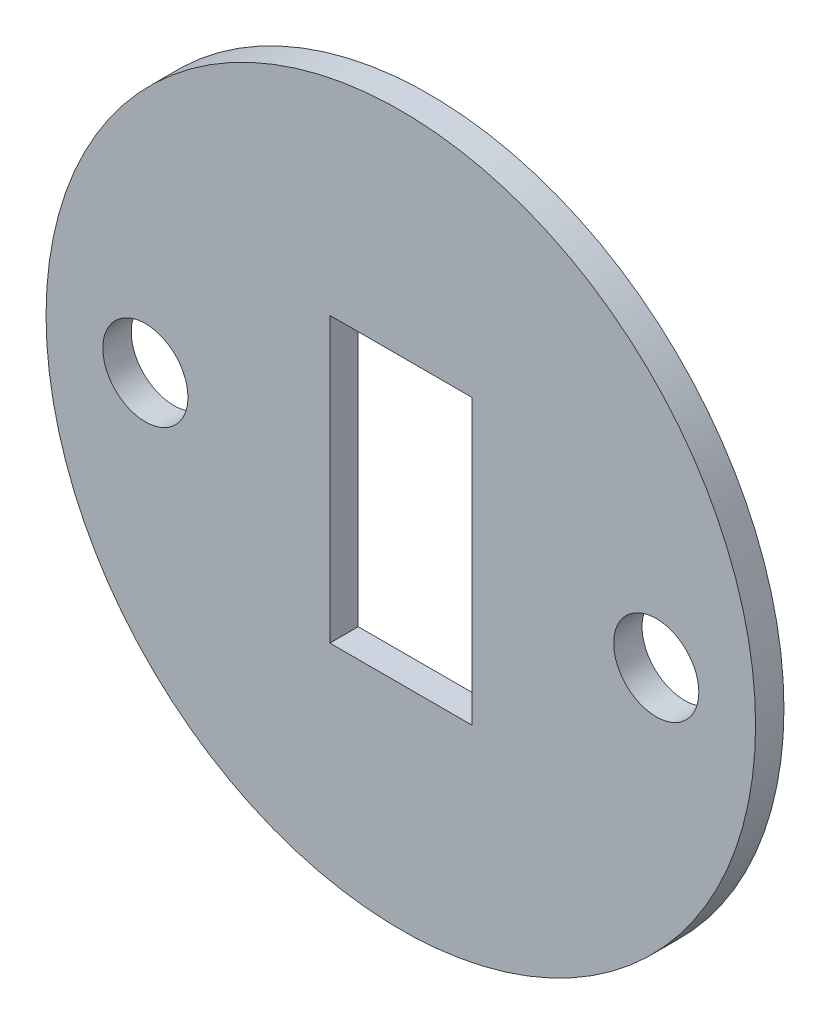
ISO-10303-21;
HEADER;
FILE_DESCRIPTION(('STEP AP214'),'2;1');
FILE_NAME('part.step','',(''),(''),'','','');
FILE_SCHEMA(('AUTOMOTIVE_DESIGN { 1 0 10303 214 1 1 1 1 }'));
ENDSEC;
DATA;
#1=APPLICATION_CONTEXT('core data for automotive mechanical design processes');
#2=APPLICATION_PROTOCOL_DEFINITION('international standard','automotive_design',2000,#1);
#3=PRODUCT_CONTEXT('',#1,'mechanical');
#4=PRODUCT('Part','Part','',(#3));
#5=PRODUCT_RELATED_PRODUCT_CATEGORY('part','',(#4));
#6=PRODUCT_DEFINITION_FORMATION('','',#4);
#7=PRODUCT_DEFINITION_CONTEXT('part definition',#1,'design');
#8=PRODUCT_DEFINITION('design','',#6,#7);
#9=PRODUCT_DEFINITION_SHAPE('','',#8);
#10=(LENGTH_UNIT() NAMED_UNIT(*) SI_UNIT(.MILLI.,.METRE.));
#11=(NAMED_UNIT(*) PLANE_ANGLE_UNIT() SI_UNIT($,.RADIAN.));
#12=(NAMED_UNIT(*) SI_UNIT($,.STERADIAN.) SOLID_ANGLE_UNIT());
#13=UNCERTAINTY_MEASURE_WITH_UNIT(LENGTH_MEASURE(1.E-05),#10,'distance_accuracy_value','');
#14=(GEOMETRIC_REPRESENTATION_CONTEXT(3) GLOBAL_UNCERTAINTY_ASSIGNED_CONTEXT((#13)) GLOBAL_UNIT_ASSIGNED_CONTEXT((#10,
#11,#12)) REPRESENTATION_CONTEXT('',''));
#15=CARTESIAN_POINT('',(0.,0.,0.));
#16=DIRECTION('',(0.,0.,1.));
#17=DIRECTION('',(1.,0.,0.));
#18=AXIS2_PLACEMENT_3D('',#15,#16,#17);
#19=CARTESIAN_POINT('',(0.,0.,2.));
#20=DIRECTION('',(0.,0.,1.));
#21=DIRECTION('',(1.,0.,0.));
#22=AXIS2_PLACEMENT_3D('',#19,#20,#21);
#23=PLANE('',#22);
#24=CARTESIAN_POINT('',(-18.,0.,2.));
#25=DIRECTION('',(0.,0.,1.));
#26=DIRECTION('',(1.,0.,0.));
#27=AXIS2_PLACEMENT_3D('',#24,#25,#26);
#28=CIRCLE('',#27,3.);
#29=CARTESIAN_POINT('',(-15.,0.,2.));
#30=VERTEX_POINT('',#29);
#31=EDGE_CURVE('E103',#30,#30,#28,.F.);
#32=ORIENTED_EDGE('',*,*,#31,.T.);
#33=EDGE_LOOP('',(#32));
#34=FACE_BOUND('',#33,.T.);
#35=CARTESIAN_POINT('',(18.,0.,2.));
#36=DIRECTION('',(0.,0.,1.));
#37=DIRECTION('',(1.,0.,0.));
#38=AXIS2_PLACEMENT_3D('',#35,#36,#37);
#39=CIRCLE('',#38,3.);
#40=CARTESIAN_POINT('',(21.,0.,2.));
#41=VERTEX_POINT('',#40);
#42=EDGE_CURVE('E106',#41,#41,#39,.F.);
#43=ORIENTED_EDGE('',*,*,#42,.T.);
#44=EDGE_LOOP('',(#43));
#45=FACE_BOUND('',#44,.T.);
#46=CARTESIAN_POINT('',(0.,0.,2.));
#47=DIRECTION('',(0.,0.,1.));
#48=DIRECTION('',(1.,0.,0.));
#49=AXIS2_PLACEMENT_3D('',#46,#47,#48);
#50=CIRCLE('',#49,25.);
#51=CARTESIAN_POINT('',(25.,0.,2.));
#52=VERTEX_POINT('',#51);
#53=EDGE_CURVE('E11',#52,#52,#50,.T.);
#54=ORIENTED_EDGE('',*,*,#53,.T.);
#55=EDGE_LOOP('',(#54));
#56=FACE_BOUND('',#55,.T.);
#57=DIRECTION('',(1.,0.,0.));
#58=VECTOR('',#57,1.);
#59=CARTESIAN_POINT('',(0.,10.,2.));
#60=LINE('',#59,#58);
#61=CARTESIAN_POINT('',(-5.,10.,2.));
#62=VERTEX_POINT('',#61);
#63=CARTESIAN_POINT('',(5.,10.,2.));
#64=VERTEX_POINT('',#63);
#65=EDGE_CURVE('E123',#62,#64,#60,.T.);
#66=ORIENTED_EDGE('',*,*,#65,.T.);
#67=DIRECTION('',(0.,-1.,0.));
#68=VECTOR('',#67,1.);
#69=CARTESIAN_POINT('',(5.,0.,2.));
#70=LINE('',#69,#68);
#71=CARTESIAN_POINT('',(5.,-10.,2.));
#72=VERTEX_POINT('',#71);
#73=EDGE_CURVE('E81',#64,#72,#70,.T.);
#74=ORIENTED_EDGE('',*,*,#73,.T.);
#75=DIRECTION('',(-1.,0.,0.));
#76=VECTOR('',#75,1.);
#77=CARTESIAN_POINT('',(0.,-10.,2.));
#78=LINE('',#77,#76);
#79=CARTESIAN_POINT('',(-5.,-10.,2.));
#80=VERTEX_POINT('',#79);
#81=EDGE_CURVE('E86',#72,#80,#78,.T.);
#82=ORIENTED_EDGE('',*,*,#81,.T.);
#83=DIRECTION('',(0.,1.,0.));
#84=VECTOR('',#83,1.);
#85=CARTESIAN_POINT('',(-5.,0.,2.));
#86=LINE('',#85,#84);
#87=EDGE_CURVE('E117',#80,#62,#86,.T.);
#88=ORIENTED_EDGE('',*,*,#87,.T.);
#89=EDGE_LOOP('',(#66,#74,#82,#88));
#90=FACE_BOUND('',#89,.T.);
#91=ADVANCED_FACE('F41',(#34,#45,#56,#90),#23,.T.);
#92=CARTESIAN_POINT('',(0.,0.,0.));
#93=DIRECTION('',(0.,0.,1.));
#94=DIRECTION('',(1.,0.,0.));
#95=AXIS2_PLACEMENT_3D('',#92,#93,#94);
#96=PLANE('',#95);
#97=CARTESIAN_POINT('',(-18.,0.,0.));
#98=DIRECTION('',(0.,0.,1.));
#99=DIRECTION('',(1.,0.,0.));
#100=AXIS2_PLACEMENT_3D('',#97,#98,#99);
#101=CIRCLE('',#100,3.);
#102=CARTESIAN_POINT('',(-15.,0.,0.));
#103=VERTEX_POINT('',#102);
#104=EDGE_CURVE('E162',#103,#103,#101,.T.);
#105=ORIENTED_EDGE('',*,*,#104,.T.);
#106=EDGE_LOOP('',(#105));
#107=FACE_BOUND('',#106,.T.);
#108=CARTESIAN_POINT('',(18.,0.,0.));
#109=DIRECTION('',(0.,0.,1.));
#110=DIRECTION('',(1.,0.,0.));
#111=AXIS2_PLACEMENT_3D('',#108,#109,#110);
#112=CIRCLE('',#111,3.);
#113=CARTESIAN_POINT('',(21.,0.,0.));
#114=VERTEX_POINT('',#113);
#115=EDGE_CURVE('E163',#114,#114,#112,.T.);
#116=ORIENTED_EDGE('',*,*,#115,.T.);
#117=EDGE_LOOP('',(#116));
#118=FACE_BOUND('',#117,.T.);
#119=CARTESIAN_POINT('',(0.,0.,0.));
#120=DIRECTION('',(0.,0.,1.));
#121=DIRECTION('',(1.,0.,0.));
#122=AXIS2_PLACEMENT_3D('',#119,#120,#121);
#123=CIRCLE('',#122,25.);
#124=CARTESIAN_POINT('',(25.,0.,0.));
#125=VERTEX_POINT('',#124);
#126=EDGE_CURVE('E44',#125,#125,#123,.T.);
#127=ORIENTED_EDGE('',*,*,#126,.F.);
#128=EDGE_LOOP('',(#127));
#129=FACE_BOUND('',#128,.T.);
#130=DIRECTION('',(0.,1.,0.));
#131=VECTOR('',#130,1.);
#132=CARTESIAN_POINT('',(5.,-10.,0.));
#133=LINE('',#132,#131);
#134=CARTESIAN_POINT('',(5.,-10.,0.));
#135=VERTEX_POINT('',#134);
#136=CARTESIAN_POINT('',(5.,10.,0.));
#137=VERTEX_POINT('',#136);
#138=EDGE_CURVE('E65',#135,#137,#133,.T.);
#139=ORIENTED_EDGE('',*,*,#138,.T.);
#140=DIRECTION('',(-1.,0.,0.));
#141=VECTOR('',#140,1.);
#142=CARTESIAN_POINT('',(-5.,10.,0.));
#143=LINE('',#142,#141);
#144=CARTESIAN_POINT('',(-5.,10.,0.));
#145=VERTEX_POINT('',#144);
#146=EDGE_CURVE('E95',#137,#145,#143,.T.);
#147=ORIENTED_EDGE('',*,*,#146,.T.);
#148=DIRECTION('',(0.,-1.,0.));
#149=VECTOR('',#148,1.);
#150=CARTESIAN_POINT('',(-5.,-10.,0.));
#151=LINE('',#150,#149);
#152=CARTESIAN_POINT('',(-5.,-10.,0.));
#153=VERTEX_POINT('',#152);
#154=EDGE_CURVE('E98',#145,#153,#151,.T.);
#155=ORIENTED_EDGE('',*,*,#154,.T.);
#156=DIRECTION('',(1.,0.,0.));
#157=VECTOR('',#156,1.);
#158=CARTESIAN_POINT('',(-5.,-10.,0.));
#159=LINE('',#158,#157);
#160=EDGE_CURVE('E105',#153,#135,#159,.T.);
#161=ORIENTED_EDGE('',*,*,#160,.T.);
#162=EDGE_LOOP('',(#139,#147,#155,#161));
#163=FACE_BOUND('',#162,.T.);
#164=ADVANCED_FACE('F101',(#107,#118,#129,#163),#96,.F.);
#165=CARTESIAN_POINT('',(0.,0.,2.));
#166=DIRECTION('',(0.,0.,-1.));
#167=DIRECTION('',(-1.,0.,0.));
#168=AXIS2_PLACEMENT_3D('',#165,#166,#167);
#169=CYLINDRICAL_SURFACE('',#168,25.);
#170=ORIENTED_EDGE('',*,*,#53,.F.);
#171=EDGE_LOOP('',(#170));
#172=FACE_BOUND('',#171,.T.);
#173=ORIENTED_EDGE('',*,*,#126,.T.);
#174=EDGE_LOOP('',(#173));
#175=FACE_BOUND('',#174,.T.);
#176=ADVANCED_FACE('F43',(#172,#175),#169,.T.);
#177=CARTESIAN_POINT('',(5.,-10.,5.));
#178=DIRECTION('',(-1.,0.,0.));
#179=DIRECTION('',(0.,0.,1.));
#180=AXIS2_PLACEMENT_3D('',#177,#178,#179);
#181=PLANE('',#180);
#182=DIRECTION('',(0.,0.,-1.));
#183=VECTOR('',#182,1.);
#184=CARTESIAN_POINT('',(5.,10.,5.));
#185=LINE('',#184,#183);
#186=EDGE_CURVE('E83',#64,#137,#185,.T.);
#187=ORIENTED_EDGE('',*,*,#186,.T.);
#188=ORIENTED_EDGE('',*,*,#138,.F.);
#189=DIRECTION('',(0.,0.,-1.));
#190=VECTOR('',#189,1.);
#191=CARTESIAN_POINT('',(5.,-10.,5.));
#192=LINE('',#191,#190);
#193=EDGE_CURVE('E115',#72,#135,#192,.T.);
#194=ORIENTED_EDGE('',*,*,#193,.F.);
#195=ORIENTED_EDGE('',*,*,#73,.F.);
#196=EDGE_LOOP('',(#187,#188,#194,#195));
#197=FACE_BOUND('',#196,.T.);
#198=ADVANCED_FACE('F82',(#197),#181,.T.);
#199=CARTESIAN_POINT('',(-5.,10.,5.));
#200=DIRECTION('',(0.,-1.,0.));
#201=DIRECTION('',(0.,0.,-1.));
#202=AXIS2_PLACEMENT_3D('',#199,#200,#201);
#203=PLANE('',#202);
#204=DIRECTION('',(0.,0.,-1.));
#205=VECTOR('',#204,1.);
#206=CARTESIAN_POINT('',(-5.,10.,5.));
#207=LINE('',#206,#205);
#208=EDGE_CURVE('E90',#62,#145,#207,.T.);
#209=ORIENTED_EDGE('',*,*,#208,.T.);
#210=ORIENTED_EDGE('',*,*,#146,.F.);
#211=ORIENTED_EDGE('',*,*,#186,.F.);
#212=ORIENTED_EDGE('',*,*,#65,.F.);
#213=EDGE_LOOP('',(#209,#210,#211,#212));
#214=FACE_BOUND('',#213,.T.);
#215=ADVANCED_FACE('F91',(#214),#203,.T.);
#216=CARTESIAN_POINT('',(-5.,-10.,5.));
#217=DIRECTION('',(1.,0.,0.));
#218=DIRECTION('',(0.,0.,-1.));
#219=AXIS2_PLACEMENT_3D('',#216,#217,#218);
#220=PLANE('',#219);
#221=DIRECTION('',(0.,0.,-1.));
#222=VECTOR('',#221,1.);
#223=CARTESIAN_POINT('',(-5.,-10.,5.));
#224=LINE('',#223,#222);
#225=EDGE_CURVE('E57',#80,#153,#224,.T.);
#226=ORIENTED_EDGE('',*,*,#225,.T.);
#227=ORIENTED_EDGE('',*,*,#154,.F.);
#228=ORIENTED_EDGE('',*,*,#208,.F.);
#229=ORIENTED_EDGE('',*,*,#87,.F.);
#230=EDGE_LOOP('',(#226,#227,#228,#229));
#231=FACE_BOUND('',#230,.T.);
#232=ADVANCED_FACE('F144',(#231),#220,.T.);
#233=CARTESIAN_POINT('',(-5.,-10.,5.));
#234=DIRECTION('',(0.,1.,0.));
#235=DIRECTION('',(0.,0.,1.));
#236=AXIS2_PLACEMENT_3D('',#233,#234,#235);
#237=PLANE('',#236);
#238=ORIENTED_EDGE('',*,*,#193,.T.);
#239=ORIENTED_EDGE('',*,*,#160,.F.);
#240=ORIENTED_EDGE('',*,*,#225,.F.);
#241=ORIENTED_EDGE('',*,*,#81,.F.);
#242=EDGE_LOOP('',(#238,#239,#240,#241));
#243=FACE_BOUND('',#242,.T.);
#244=ADVANCED_FACE('F146',(#243),#237,.T.);
#245=CARTESIAN_POINT('',(18.,0.,5.));
#246=DIRECTION('',(0.,0.,-1.));
#247=DIRECTION('',(-1.,0.,0.));
#248=AXIS2_PLACEMENT_3D('',#245,#246,#247);
#249=CYLINDRICAL_SURFACE('',#248,3.);
#250=ORIENTED_EDGE('',*,*,#42,.F.);
#251=EDGE_LOOP('',(#250));
#252=FACE_BOUND('',#251,.T.);
#253=ORIENTED_EDGE('',*,*,#115,.F.);
#254=EDGE_LOOP('',(#253));
#255=FACE_BOUND('',#254,.T.);
#256=ADVANCED_FACE('F155',(#252,#255),#249,.F.);
#257=CARTESIAN_POINT('',(-18.,0.,5.));
#258=DIRECTION('',(0.,0.,-1.));
#259=DIRECTION('',(-1.,0.,0.));
#260=AXIS2_PLACEMENT_3D('',#257,#258,#259);
#261=CYLINDRICAL_SURFACE('',#260,3.);
#262=ORIENTED_EDGE('',*,*,#31,.F.);
#263=EDGE_LOOP('',(#262));
#264=FACE_BOUND('',#263,.T.);
#265=ORIENTED_EDGE('',*,*,#104,.F.);
#266=EDGE_LOOP('',(#265));
#267=FACE_BOUND('',#266,.T.);
#268=ADVANCED_FACE('F152',(#264,#267),#261,.F.);
#269=CLOSED_SHELL('',(#91,#164,#176,#198,#215,#232,#244,#256,#268));
#270=MANIFOLD_SOLID_BREP('B2',#269);
#271=ADVANCED_BREP_SHAPE_REPRESENTATION('',(#18,#270),#14);
#272=SHAPE_DEFINITION_REPRESENTATION(#9,#271);
ENDSEC;
END-ISO-10303-21;
